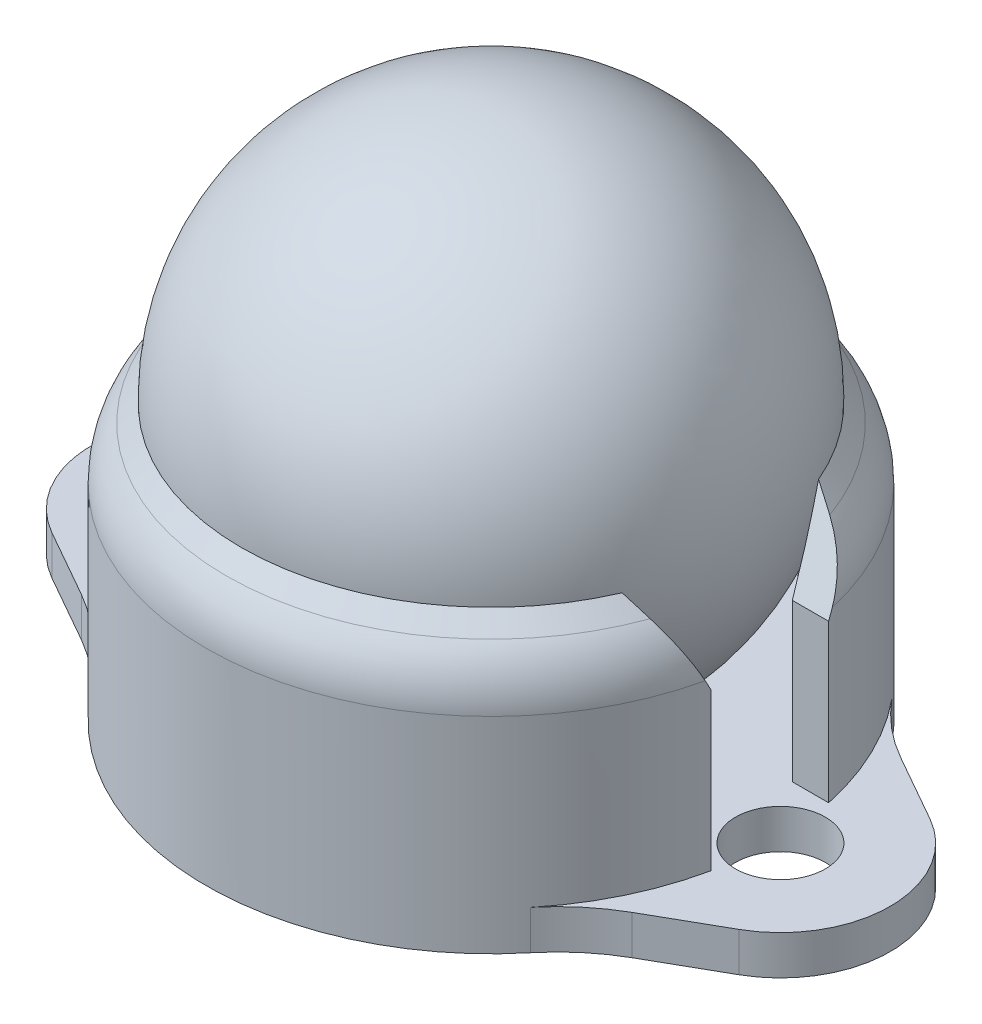
ISO-10303-21;
HEADER;
FILE_DESCRIPTION(('STEP AP214'),'2;1');
FILE_NAME('part.step','',(''),(''),'','','');
FILE_SCHEMA(('AUTOMOTIVE_DESIGN { 1 0 10303 214 1 1 1 1 }'));
ENDSEC;
DATA;
#1=APPLICATION_CONTEXT('core data for automotive mechanical design processes');
#2=APPLICATION_PROTOCOL_DEFINITION('international standard','automotive_design',2000,#1);
#3=PRODUCT_CONTEXT('',#1,'mechanical');
#4=PRODUCT('Part','Part','',(#3));
#5=PRODUCT_RELATED_PRODUCT_CATEGORY('part','',(#4));
#6=PRODUCT_DEFINITION_FORMATION('','',#4);
#7=PRODUCT_DEFINITION_CONTEXT('part definition',#1,'design');
#8=PRODUCT_DEFINITION('design','',#6,#7);
#9=PRODUCT_DEFINITION_SHAPE('','',#8);
#10=(LENGTH_UNIT() NAMED_UNIT(*) SI_UNIT(.MILLI.,.METRE.));
#11=(NAMED_UNIT(*) PLANE_ANGLE_UNIT() SI_UNIT($,.RADIAN.));
#12=(NAMED_UNIT(*) SI_UNIT($,.STERADIAN.) SOLID_ANGLE_UNIT());
#13=UNCERTAINTY_MEASURE_WITH_UNIT(LENGTH_MEASURE(1.E-05),#10,'distance_accuracy_value','');
#14=(GEOMETRIC_REPRESENTATION_CONTEXT(3) GLOBAL_UNCERTAINTY_ASSIGNED_CONTEXT((#13)) GLOBAL_UNIT_ASSIGNED_CONTEXT((#10,
#11,#12)) REPRESENTATION_CONTEXT('',''));
#15=CARTESIAN_POINT('',(0.,0.,0.));
#16=DIRECTION('',(0.,0.,1.));
#17=DIRECTION('',(1.,0.,0.));
#18=AXIS2_PLACEMENT_3D('',#15,#16,#17);
#19=CARTESIAN_POINT('',(0.,7.112,0.));
#20=DIRECTION('',(0.,-1.,0.));
#21=DIRECTION('',(1.,0.,0.));
#22=AXIS2_PLACEMENT_3D('',#19,#20,#21);
#23=SPHERICAL_SURFACE('',#22,6.35);
#24=CARTESIAN_POINT('',(0.,0.762000000000001,0.));
#25=VERTEX_POINT('',#24);
#26=VERTEX_LOOP('',#25);
#27=FACE_BOUND('',#26,.T.);
#28=ADVANCED_FACE('F41',(#27),#23,.T.);
#29=CLOSED_SHELL('',(#28));
#30=MANIFOLD_SOLID_BREP('B2',#29);
#31=CARTESIAN_POINT('',(0.,1.,0.));
#32=DIRECTION('',(0.,-1.,0.));
#33=DIRECTION('',(0.,0.,-1.));
#34=AXIS2_PLACEMENT_3D('',#31,#32,#33);
#35=CYLINDRICAL_SURFACE('',#34,7.25);
#36=CARTESIAN_POINT('',(0.,2.,0.));
#37=DIRECTION('',(0.,0.447213595499958,0.894427190999916));
#38=DIRECTION('',(0.,-0.894427190999916,0.447213595499958));
#39=AXIS2_PLACEMENT_3D('',#36,#37,#38);
#40=ELLIPSE('',#39,16.2114928368735,7.25);
#41=CARTESIAN_POINT('',(-7.06761644124185,5.23190212691408,-1.61595106345704));
#42=VERTEX_POINT('',#41);
#43=CARTESIAN_POINT('',(-7.09313047955555,5.,-1.5));
#44=VERTEX_POINT('',#43);
#45=EDGE_CURVE('E229',#42,#44,#40,.T.);
#46=ORIENTED_EDGE('',*,*,#45,.F.);
#47=CARTESIAN_POINT('',(0.,5.23190212691408,0.));
#48=DIRECTION('',(0.,-1.,0.));
#49=DIRECTION('',(0.,0.,-1.));
#50=AXIS2_PLACEMENT_3D('',#47,#48,#49);
#51=CIRCLE('',#50,7.25);
#52=CARTESIAN_POINT('',(7.06761644124185,5.23190212691408,-1.61595106345704));
#53=VERTEX_POINT('',#52);
#54=EDGE_CURVE('E353',#42,#53,#51,.T.);
#55=ORIENTED_EDGE('',*,*,#54,.T.);
#56=CARTESIAN_POINT('',(7.09313047955555,5.,-1.5));
#57=VERTEX_POINT('',#56);
#58=EDGE_CURVE('E242',#57,#53,#40,.T.);
#59=ORIENTED_EDGE('',*,*,#58,.F.);
#60=DIRECTION('',(0.,-1.,0.));
#61=VECTOR('',#60,1.);
#62=CARTESIAN_POINT('',(7.09313047955555,1.,-1.5));
#63=LINE('',#62,#61);
#64=CARTESIAN_POINT('',(7.09313047955555,1.,-1.5));
#65=VERTEX_POINT('',#64);
#66=EDGE_CURVE('E254',#65,#57,#63,.F.);
#67=ORIENTED_EDGE('',*,*,#66,.F.);
#68=CARTESIAN_POINT('',(0.,1.,0.));
#69=DIRECTION('',(0.,-1.,0.));
#70=DIRECTION('',(0.,0.,-1.));
#71=AXIS2_PLACEMENT_3D('',#68,#69,#70);
#72=CIRCLE('',#71,7.25);
#73=CARTESIAN_POINT('',(5.60718383416359,1.,-4.59586656136735));
#74=VERTEX_POINT('',#73);
#75=EDGE_CURVE('E356',#74,#65,#72,.T.);
#76=ORIENTED_EDGE('',*,*,#75,.F.);
#77=DIRECTION('',(0.,-1.,0.));
#78=VECTOR('',#77,1.);
#79=CARTESIAN_POINT('',(5.60718383416359,1.,-4.59586656136735));
#80=LINE('',#79,#78);
#81=CARTESIAN_POINT('',(5.60718383416359,0.,-4.59586656136735));
#82=VERTEX_POINT('',#81);
#83=EDGE_CURVE('E457',#74,#82,#80,.T.);
#84=ORIENTED_EDGE('',*,*,#83,.T.);
#85=CARTESIAN_POINT('',(0.,0.,0.));
#86=DIRECTION('',(0.,1.,0.));
#87=DIRECTION('',(0.,0.,1.));
#88=AXIS2_PLACEMENT_3D('',#85,#86,#87);
#89=CIRCLE('',#88,7.25);
#90=CARTESIAN_POINT('',(-5.60718383416359,0.,-4.59586656136735));
#91=VERTEX_POINT('',#90);
#92=EDGE_CURVE('E443',#82,#91,#89,.T.);
#93=ORIENTED_EDGE('',*,*,#92,.T.);
#94=DIRECTION('',(0.,-1.,0.));
#95=VECTOR('',#94,1.);
#96=CARTESIAN_POINT('',(-5.60718383416359,1.,-4.59586656136735));
#97=LINE('',#96,#95);
#98=CARTESIAN_POINT('',(-5.60718383416359,1.,-4.59586656136735));
#99=VERTEX_POINT('',#98);
#100=EDGE_CURVE('E366',#99,#91,#97,.T.);
#101=ORIENTED_EDGE('',*,*,#100,.F.);
#102=CARTESIAN_POINT('',(-7.09313047955555,1.,-1.5));
#103=VERTEX_POINT('',#102);
#104=EDGE_CURVE('E252',#103,#99,#72,.T.);
#105=ORIENTED_EDGE('',*,*,#104,.F.);
#106=DIRECTION('',(0.,-1.,0.));
#107=VECTOR('',#106,1.);
#108=CARTESIAN_POINT('',(-7.09313047955555,1.,-1.5));
#109=LINE('',#108,#107);
#110=EDGE_CURVE('E245',#44,#103,#109,.T.);
#111=ORIENTED_EDGE('',*,*,#110,.F.);
#112=EDGE_LOOP('',(#46,#55,#59,#67,#76,#84,#93,#101,#105,#111));
#113=FACE_BOUND('',#112,.T.);
#114=ADVANCED_FACE('F54',(#113),#35,.T.);
#115=CARTESIAN_POINT('',(0.,5.23190212691408,0.));
#116=DIRECTION('',(0.,-1.,0.));
#117=DIRECTION('',(0.,0.,-1.));
#118=AXIS2_PLACEMENT_3D('',#115,#116,#117);
#119=TOROIDAL_SURFACE('',#118,5.25,2.);
#120=CARTESIAN_POINT('',(0.,6.57064228665848,0.));
#121=DIRECTION('',(0.,-1.,0.));
#122=DIRECTION('',(0.,0.,-1.));
#123=AXIS2_PLACEMENT_3D('',#120,#121,#122);
#124=CIRCLE('',#123,6.73585826534281);
#125=CARTESIAN_POINT('',(-6.33633126048816,6.57064228665848,-2.28532114332924));
#126=VERTEX_POINT('',#125);
#127=CARTESIAN_POINT('',(6.33633126048816,6.57064228665848,-2.28532114332924));
#128=VERTEX_POINT('',#127);
#129=EDGE_CURVE('E349',#126,#128,#124,.T.);
#130=ORIENTED_EDGE('',*,*,#129,.T.);
#131=CARTESIAN_POINT('',(6.33610360567806,6.57084228665848,-2.28542114332924));
#132=CARTESIAN_POINT('',(6.38720905247654,6.52595006579763,-2.26297503289881));
#133=CARTESIAN_POINT('',(6.43619885751783,6.47916484933496,-2.23958242466748));
#134=CARTESIAN_POINT('',(6.5296141205372,6.38207336245779,-2.19103668122889));
#135=CARTESIAN_POINT('',(6.57403910189025,6.33176672528274,-2.16588336264137));
#136=CARTESIAN_POINT('',(6.6974554096252,6.17906551212596,-2.08953275606298));
#137=CARTESIAN_POINT('',(6.76965959015316,6.07218143816049,-2.03609071908025));
#138=CARTESIAN_POINT('',(6.89333253889709,5.84824603708838,-1.92412301854419));
#139=CARTESIAN_POINT('',(6.94465554716202,5.73112994564584,-1.86556497282292));
#140=CARTESIAN_POINT('',(7.00448934248536,5.54910103338356,-1.77455051669178));
#141=CARTESIAN_POINT('',(7.02169421977967,5.48639515666394,-1.74319757833197));
#142=CARTESIAN_POINT('',(7.04960290403054,5.35980992303815,-1.67990496151907));
#143=CARTESIAN_POINT('',(7.06030389415051,5.29593007000405,-1.64796503500202));
#144=CARTESIAN_POINT('',(7.06763929439843,5.23170212691408,-1.61585106345704));
#145=B_SPLINE_CURVE_WITH_KNOTS('',3,(#131,#132,#133,#134,#135,#136,#137,#138,#139,#140,#141,
#142,#143,#144),.UNSPECIFIED.,.F.,.F.,(4,2,2,2,2,2,4),(0.,0.214773507266159,0.42956941685027,
0.846385742050743,1.26606367421198,1.48235583176192,1.69874159891815),.UNSPECIFIED.);
#146=EDGE_CURVE('E293',#128,#53,#145,.T.);
#147=ORIENTED_EDGE('',*,*,#146,.T.);
#148=ORIENTED_EDGE('',*,*,#54,.F.);
#149=CARTESIAN_POINT('',(-7.06763929439843,5.23170212691408,-1.61585106345704));
#150=CARTESIAN_POINT('',(-7.06066962741802,5.29273547119952,-1.64636773559976));
#151=CARTESIAN_POINT('',(-7.05065900533507,5.35345846114629,-1.67672923057315));
#152=CARTESIAN_POINT('',(-7.02475089286815,5.47386509060165,-1.73693254530082));
#153=CARTESIAN_POINT('',(-7.00885598370298,5.53354917383855,-1.76677458691928));
#154=CARTESIAN_POINT('',(-6.95368899624164,5.70714399689122,-1.85357199844561));
#155=CARTESIAN_POINT('',(-6.90650793163667,5.81910628251045,-1.90955314125522));
#156=CARTESIAN_POINT('',(-6.78710624085704,6.04487167275266,-2.02243583637633));
#157=CARTESIAN_POINT('',(-6.71294667405066,6.15785600179062,-2.07892800089531));
#158=CARTESIAN_POINT('',(-6.58500078256002,6.31904700660519,-2.1595235033026));
#159=CARTESIAN_POINT('',(-6.53871811930285,6.37214575803145,-2.18607287901573));
#160=CARTESIAN_POINT('',(-6.44110239471256,6.47447106276408,-2.23723553138204));
#161=CARTESIAN_POINT('',(-6.38977042612975,6.52369844976389,-2.26184922488195));
#162=CARTESIAN_POINT('',(-6.33610360567806,6.57084228665848,-2.28542114332924));
#163=B_SPLINE_CURVE_WITH_KNOTS('',3,(#149,#150,#151,#152,#153,#154,#155,#156,#157,#158,#159,
#160,#161,#162),.UNSPECIFIED.,.F.,.F.,(4,2,2,2,2,2,4),(0.,0.20564259875086,0.411195096394616,
0.810619462241715,1.24764195242736,1.47321368363546,1.69873670447507),.UNSPECIFIED.);
#164=EDGE_CURVE('E235',#42,#126,#163,.T.);
#165=ORIENTED_EDGE('',*,*,#164,.T.);
#166=EDGE_LOOP('',(#130,#147,#148,#165));
#167=FACE_BOUND('',#166,.T.);
#168=ADVANCED_FACE('F310',(#167),#119,.T.);
#169=CARTESIAN_POINT('',(0.,6.57064228665848,0.));
#170=DIRECTION('',(0.,-1.,0.));
#171=DIRECTION('',(0.,0.,-1.));
#172=AXIS2_PLACEMENT_3D('',#169,#170,#171);
#173=CONICAL_SURFACE('',#172,6.73585826534281,0.733360576003534);
#174=CARTESIAN_POINT('',(0.,7.,0.));
#175=DIRECTION('',(0.,-1.,0.));
#176=DIRECTION('',(0.,0.,-1.));
#177=AXIS2_PLACEMENT_3D('',#174,#175,#176);
#178=CIRCLE('',#177,6.34901220663498);
#179=CARTESIAN_POINT('',(-5.83609081492055,7.,-2.5));
#180=VERTEX_POINT('',#179);
#181=CARTESIAN_POINT('',(5.83609081492055,7.,-2.5));
#182=VERTEX_POINT('',#181);
#183=EDGE_CURVE('E340',#180,#182,#178,.T.);
#184=ORIENTED_EDGE('',*,*,#183,.T.);
#185=CARTESIAN_POINT('',(5.83585194033158,7.0002,-2.5001));
#186=CARTESIAN_POINT('',(5.87807255301973,6.96485064787608,-2.48242532393804));
#187=CARTESIAN_POINT('',(5.92016358221079,6.92937761447314,-2.46468880723657));
#188=CARTESIAN_POINT('',(6.00409406345178,6.85819694235963,-2.42909847117981));
#189=CARTESIAN_POINT('',(6.0459335245734,6.82248931220709,-2.41124465610354));
#190=CARTESIAN_POINT('',(6.12937139967283,6.75084974203165,-2.37542487101583));
#191=CARTESIAN_POINT('',(6.17096981435526,6.71491780266509,-2.35745890133254));
#192=CARTESIAN_POINT('',(6.25393576360961,6.64283861144875,-2.32141930572438));
#193=CARTESIAN_POINT('',(6.29530328975066,6.60669135183494,-2.30334567591747));
#194=CARTESIAN_POINT('',(6.33655888473935,6.57044228665848,-2.28522114332924));
#195=B_SPLINE_CURVE_WITH_KNOTS('',3,(#185,#186,#187,#188,#189,#190,#191,#192,#193,#194),
.UNSPECIFIED.,.F.,.F.,(4,2,2,2,4),(0.,0.173495818993947,0.346985343655919,0.520474360920202,
0.693969672202868),.UNSPECIFIED.);
#196=EDGE_CURVE('E240',#182,#128,#195,.T.);
#197=ORIENTED_EDGE('',*,*,#196,.T.);
#198=ORIENTED_EDGE('',*,*,#129,.F.);
#199=CARTESIAN_POINT('',(-6.33655888473935,6.57044228665848,-2.28522114332924));
#200=CARTESIAN_POINT('',(-6.29530328975066,6.60669135183494,-2.30334567591747));
#201=CARTESIAN_POINT('',(-6.25393576360961,6.64283861144875,-2.32141930572438));
#202=CARTESIAN_POINT('',(-6.17096981435526,6.71491780266509,-2.35745890133254));
#203=CARTESIAN_POINT('',(-6.12937139967282,6.75084974203165,-2.37542487101583));
#204=CARTESIAN_POINT('',(-6.0459335245734,6.82248931220709,-2.41124465610354));
#205=CARTESIAN_POINT('',(-6.00409406345178,6.85819694235963,-2.42909847117981));
#206=CARTESIAN_POINT('',(-5.92016358221079,6.92937761447314,-2.46468880723657));
#207=CARTESIAN_POINT('',(-5.87807255301973,6.96485064787608,-2.48242532393804));
#208=CARTESIAN_POINT('',(-5.83585194033158,7.0002,-2.5001));
#209=B_SPLINE_CURVE_WITH_KNOTS('',3,(#199,#200,#201,#202,#203,#204,#205,#206,#207,#208),
.UNSPECIFIED.,.F.,.F.,(4,2,2,2,4),(0.,0.173495311282667,0.346984328546951,0.520473853208922,
0.69396967220287),.UNSPECIFIED.);
#210=EDGE_CURVE('E253',#126,#180,#209,.T.);
#211=ORIENTED_EDGE('',*,*,#210,.T.);
#212=EDGE_LOOP('',(#184,#197,#198,#211));
#213=FACE_BOUND('',#212,.T.);
#214=ADVANCED_FACE('F581',(#213),#173,.T.);
#215=CARTESIAN_POINT('',(0.,0.,0.));
#216=DIRECTION('',(0.,-1.,0.));
#217=DIRECTION('',(0.,0.,-1.));
#218=AXIS2_PLACEMENT_3D('',#215,#216,#217);
#219=CYLINDRICAL_SURFACE('',#218,6.34901220663498);
#220=ORIENTED_EDGE('',*,*,#183,.F.);
#221=CARTESIAN_POINT('',(0.,2.,0.));
#222=DIRECTION('',(0.,0.447213595499958,0.894427190999916));
#223=DIRECTION('',(0.,-0.894427190999916,0.447213595499958));
#224=AXIS2_PLACEMENT_3D('',#221,#222,#223);
#225=ELLIPSE('',#224,14.1968228840118,6.34901220663498);
#226=CARTESIAN_POINT('',(-6.16927516001677,5.,-1.5));
#227=VERTEX_POINT('',#226);
#228=EDGE_CURVE('E380',#180,#227,#225,.T.);
#229=ORIENTED_EDGE('',*,*,#228,.T.);
#230=DIRECTION('',(0.,-1.,0.));
#231=VECTOR('',#230,1.);
#232=CARTESIAN_POINT('',(-6.16927516001677,0.,-1.5));
#233=LINE('',#232,#231);
#234=CARTESIAN_POINT('',(-6.16927516001678,1.,-1.5));
#235=VERTEX_POINT('',#234);
#236=EDGE_CURVE('E248',#227,#235,#233,.T.);
#237=ORIENTED_EDGE('',*,*,#236,.T.);
#238=CARTESIAN_POINT('',(0.,1.,0.));
#239=DIRECTION('',(0.,-1.,0.));
#240=DIRECTION('',(0.,0.,-1.));
#241=AXIS2_PLACEMENT_3D('',#238,#239,#240);
#242=CIRCLE('',#241,6.34901220663498);
#243=CARTESIAN_POINT('',(6.16927516001678,1.,-1.5));
#244=VERTEX_POINT('',#243);
#245=EDGE_CURVE('E341',#235,#244,#242,.T.);
#246=ORIENTED_EDGE('',*,*,#245,.T.);
#247=DIRECTION('',(0.,-1.,0.));
#248=VECTOR('',#247,1.);
#249=CARTESIAN_POINT('',(6.16927516001677,0.,-1.5));
#250=LINE('',#249,#248);
#251=CARTESIAN_POINT('',(6.16927516001677,5.,-1.5));
#252=VERTEX_POINT('',#251);
#253=EDGE_CURVE('E385',#244,#252,#250,.F.);
#254=ORIENTED_EDGE('',*,*,#253,.T.);
#255=EDGE_CURVE('E382',#252,#182,#225,.T.);
#256=ORIENTED_EDGE('',*,*,#255,.T.);
#257=EDGE_LOOP('',(#220,#229,#237,#246,#254,#256));
#258=FACE_BOUND('',#257,.T.);
#259=ADVANCED_FACE('F584',(#258),#219,.F.);
#260=CARTESIAN_POINT('',(-7.366,1.,0.));
#261=DIRECTION('',(0.,1.,0.));
#262=DIRECTION('',(0.,0.,1.));
#263=AXIS2_PLACEMENT_3D('',#260,#261,#262);
#264=PLANE('',#263);
#265=CARTESIAN_POINT('',(6.16927516001678,1.,1.5));
#266=VERTEX_POINT('',#265);
#267=CARTESIAN_POINT('',(-6.16927516001677,1.,1.5));
#268=VERTEX_POINT('',#267);
#269=EDGE_CURVE('E344',#266,#268,#242,.T.);
#270=ORIENTED_EDGE('',*,*,#269,.F.);
#271=DIRECTION('',(1.,0.,0.));
#272=VECTOR('',#271,1.);
#273=CARTESIAN_POINT('',(-10.16,1.,1.5));
#274=LINE('',#273,#272);
#275=CARTESIAN_POINT('',(7.09313047955555,1.,1.5));
#276=VERTEX_POINT('',#275);
#277=EDGE_CURVE('E497',#266,#276,#274,.T.);
#278=ORIENTED_EDGE('',*,*,#277,.T.);
#279=CARTESIAN_POINT('',(5.60718383416359,1.,4.59586656136735));
#280=VERTEX_POINT('',#279);
#281=EDGE_CURVE('E58',#276,#280,#72,.T.);
#282=ORIENTED_EDGE('',*,*,#281,.T.);
#283=CARTESIAN_POINT('',(9.47420716806951,1.,7.76542970713794));
#284=DIRECTION('',(0.,-1.,0.));
#285=DIRECTION('',(0.,0.,1.));
#286=AXIS2_PLACEMENT_3D('',#283,#284,#285);
#287=CIRCLE('',#286,5.);
#288=CARTESIAN_POINT('',(7.00594574266768,1.,3.41713285252079));
#289=VERTEX_POINT('',#288);
#290=EDGE_CURVE('E397',#280,#289,#287,.T.);
#291=ORIENTED_EDGE('',*,*,#290,.T.);
#292=DIRECTION('',(0.869659370923429,0.,-0.493652285080366));
#293=VECTOR('',#292,1.);
#294=CARTESIAN_POINT('',(8.74526448451454,1.,2.42982828236006));
#295=LINE('',#294,#293);
#296=CARTESIAN_POINT('',(8.74526448451454,1.,2.42982828236006));
#297=VERTEX_POINT('',#296);
#298=EDGE_CURVE('E403',#289,#297,#295,.T.);
#299=ORIENTED_EDGE('',*,*,#298,.T.);
#300=CARTESIAN_POINT('',(7.366,1.,0.));
#301=DIRECTION('',(0.,1.,0.));
#302=DIRECTION('',(0.,0.,-1.));
#303=AXIS2_PLACEMENT_3D('',#300,#301,#302);
#304=CIRCLE('',#303,2.794);
#305=CARTESIAN_POINT('',(8.74526448451454,1.,-2.42982828236006));
#306=VERTEX_POINT('',#305);
#307=EDGE_CURVE('E414',#297,#306,#304,.T.);
#308=ORIENTED_EDGE('',*,*,#307,.T.);
#309=DIRECTION('',(-0.869659370923429,0.,-0.493652285080366));
#310=VECTOR('',#309,1.);
#311=CARTESIAN_POINT('',(8.74526448451454,1.,-2.42982828236006));
#312=LINE('',#311,#310);
#313=CARTESIAN_POINT('',(7.00594574266768,1.,-3.41713285252079));
#314=VERTEX_POINT('',#313);
#315=EDGE_CURVE('E416',#306,#314,#312,.T.);
#316=ORIENTED_EDGE('',*,*,#315,.T.);
#317=CARTESIAN_POINT('',(9.47420716806951,1.,-7.76542970713794));
#318=DIRECTION('',(0.,-1.,0.));
#319=DIRECTION('',(0.,0.,-1.));
#320=AXIS2_PLACEMENT_3D('',#317,#318,#319);
#321=CIRCLE('',#320,5.);
#322=EDGE_CURVE('E418',#314,#74,#321,.T.);
#323=ORIENTED_EDGE('',*,*,#322,.T.);
#324=ORIENTED_EDGE('',*,*,#75,.T.);
#325=DIRECTION('',(1.,0.,0.));
#326=VECTOR('',#325,1.);
#327=CARTESIAN_POINT('',(-10.16,1.,-1.5));
#328=LINE('',#327,#326);
#329=EDGE_CURVE('E545',#244,#65,#328,.T.);
#330=ORIENTED_EDGE('',*,*,#329,.F.);
#331=ORIENTED_EDGE('',*,*,#245,.F.);
#332=EDGE_CURVE('E543',#103,#235,#328,.T.);
#333=ORIENTED_EDGE('',*,*,#332,.F.);
#334=ORIENTED_EDGE('',*,*,#104,.T.);
#335=CARTESIAN_POINT('',(-9.47420716806951,1.,-7.76542970713794));
#336=DIRECTION('',(0.,-1.,0.));
#337=DIRECTION('',(0.,0.,1.));
#338=AXIS2_PLACEMENT_3D('',#335,#336,#337);
#339=CIRCLE('',#338,5.);
#340=CARTESIAN_POINT('',(-7.00594574266768,1.,-3.41713285252079));
#341=VERTEX_POINT('',#340);
#342=EDGE_CURVE('E422',#99,#341,#339,.T.);
#343=ORIENTED_EDGE('',*,*,#342,.T.);
#344=DIRECTION('',(-0.869659370923429,0.,0.493652285080366));
#345=VECTOR('',#344,1.);
#346=CARTESIAN_POINT('',(-8.74526448451454,1.,-2.42982828236006));
#347=LINE('',#346,#345);
#348=CARTESIAN_POINT('',(-8.74526448451454,1.,-2.42982828236006));
#349=VERTEX_POINT('',#348);
#350=EDGE_CURVE('E419',#341,#349,#347,.T.);
#351=ORIENTED_EDGE('',*,*,#350,.T.);
#352=CARTESIAN_POINT('',(-7.366,1.,0.));
#353=DIRECTION('',(0.,1.,0.));
#354=DIRECTION('',(0.,0.,1.));
#355=AXIS2_PLACEMENT_3D('',#352,#353,#354);
#356=CIRCLE('',#355,2.794);
#357=CARTESIAN_POINT('',(-8.74526448451454,1.,2.42982828236006));
#358=VERTEX_POINT('',#357);
#359=EDGE_CURVE('E405',#349,#358,#356,.T.);
#360=ORIENTED_EDGE('',*,*,#359,.T.);
#361=DIRECTION('',(0.869659370923429,0.,0.493652285080366));
#362=VECTOR('',#361,1.);
#363=CARTESIAN_POINT('',(-8.74526448451454,1.,2.42982828236006));
#364=LINE('',#363,#362);
#365=CARTESIAN_POINT('',(-7.00594574266768,1.,3.41713285252079));
#366=VERTEX_POINT('',#365);
#367=EDGE_CURVE('E398',#358,#366,#364,.T.);
#368=ORIENTED_EDGE('',*,*,#367,.T.);
#369=CARTESIAN_POINT('',(-9.47420716806951,1.,7.76542970713794));
#370=DIRECTION('',(0.,-1.,0.));
#371=DIRECTION('',(0.,0.,-1.));
#372=AXIS2_PLACEMENT_3D('',#369,#370,#371);
#373=CIRCLE('',#372,5.);
#374=CARTESIAN_POINT('',(-5.60718383416359,1.,4.59586656136735));
#375=VERTEX_POINT('',#374);
#376=EDGE_CURVE('E396',#366,#375,#373,.T.);
#377=ORIENTED_EDGE('',*,*,#376,.T.);
#378=CARTESIAN_POINT('',(-7.09313047955555,1.,1.5));
#379=VERTEX_POINT('',#378);
#380=EDGE_CURVE('E372',#375,#379,#72,.T.);
#381=ORIENTED_EDGE('',*,*,#380,.T.);
#382=EDGE_CURVE('E258',#379,#268,#274,.T.);
#383=ORIENTED_EDGE('',*,*,#382,.T.);
#384=EDGE_LOOP('',(#270,#278,#282,#291,#299,#308,#316,#323,#324,#330,#331,#333,#334,#343,#351,
#360,#368,#377,#381,#383));
#385=FACE_BOUND('',#384,.T.);
#386=CARTESIAN_POINT('',(7.366,1.,0.));
#387=DIRECTION('',(0.,1.,0.));
#388=DIRECTION('',(0.,0.,-1.));
#389=AXIS2_PLACEMENT_3D('',#386,#387,#388);
#390=CIRCLE('',#389,1.143);
#391=CARTESIAN_POINT('',(7.366,1.,-1.143));
#392=VERTEX_POINT('',#391);
#393=EDGE_CURVE('E360',#392,#392,#390,.T.);
#394=ORIENTED_EDGE('',*,*,#393,.F.);
#395=EDGE_LOOP('',(#394));
#396=FACE_BOUND('',#395,.T.);
#397=CARTESIAN_POINT('',(-7.366,1.,0.));
#398=DIRECTION('',(0.,1.,0.));
#399=DIRECTION('',(0.,0.,1.));
#400=AXIS2_PLACEMENT_3D('',#397,#398,#399);
#401=CIRCLE('',#400,1.143);
#402=CARTESIAN_POINT('',(-7.366,1.,1.143));
#403=VERTEX_POINT('',#402);
#404=EDGE_CURVE('E427',#403,#403,#401,.T.);
#405=ORIENTED_EDGE('',*,*,#404,.F.);
#406=EDGE_LOOP('',(#405));
#407=FACE_BOUND('',#406,.T.);
#408=ADVANCED_FACE('F493',(#385,#396,#407),#264,.T.);
#409=CARTESIAN_POINT('',(-7.366,0.,0.));
#410=DIRECTION('',(0.,1.,0.));
#411=DIRECTION('',(0.,0.,1.));
#412=AXIS2_PLACEMENT_3D('',#409,#410,#411);
#413=PLANE('',#412);
#414=CARTESIAN_POINT('',(-7.366,0.,0.));
#415=DIRECTION('',(0.,1.,0.));
#416=DIRECTION('',(0.,0.,1.));
#417=AXIS2_PLACEMENT_3D('',#414,#415,#416);
#418=CIRCLE('',#417,1.143);
#419=CARTESIAN_POINT('',(-7.366,0.,1.143));
#420=VERTEX_POINT('',#419);
#421=EDGE_CURVE('E645',#420,#420,#418,.T.);
#422=ORIENTED_EDGE('',*,*,#421,.T.);
#423=EDGE_LOOP('',(#422));
#424=FACE_BOUND('',#423,.T.);
#425=CARTESIAN_POINT('',(-7.366,0.,0.));
#426=DIRECTION('',(0.,1.,0.));
#427=DIRECTION('',(0.,0.,1.));
#428=AXIS2_PLACEMENT_3D('',#425,#426,#427);
#429=CIRCLE('',#428,2.794);
#430=CARTESIAN_POINT('',(-8.74526448451454,0.,-2.42982828236006));
#431=VERTEX_POINT('',#430);
#432=CARTESIAN_POINT('',(-8.74526448451454,0.,2.42982828236006));
#433=VERTEX_POINT('',#432);
#434=EDGE_CURVE('E423',#431,#433,#429,.T.);
#435=ORIENTED_EDGE('',*,*,#434,.F.);
#436=DIRECTION('',(-0.869659370923429,0.,0.493652285080366));
#437=VECTOR('',#436,1.);
#438=CARTESIAN_POINT('',(-8.74526448451454,0.,-2.42982828236006));
#439=LINE('',#438,#437);
#440=CARTESIAN_POINT('',(-7.00594574266768,0.,-3.41713285252079));
#441=VERTEX_POINT('',#440);
#442=EDGE_CURVE('E409',#441,#431,#439,.T.);
#443=ORIENTED_EDGE('',*,*,#442,.F.);
#444=CARTESIAN_POINT('',(-9.47420716806951,0.,-7.76542970713794));
#445=DIRECTION('',(0.,-1.,0.));
#446=DIRECTION('',(0.,0.,1.));
#447=AXIS2_PLACEMENT_3D('',#444,#445,#446);
#448=CIRCLE('',#447,5.);
#449=EDGE_CURVE('E445',#91,#441,#448,.T.);
#450=ORIENTED_EDGE('',*,*,#449,.F.);
#451=ORIENTED_EDGE('',*,*,#92,.F.);
#452=CARTESIAN_POINT('',(9.47420716806951,0.,-7.76542970713794));
#453=DIRECTION('',(0.,-1.,0.));
#454=DIRECTION('',(0.,0.,-1.));
#455=AXIS2_PLACEMENT_3D('',#452,#453,#454);
#456=CIRCLE('',#455,5.);
#457=CARTESIAN_POINT('',(7.00594574266768,0.,-3.41713285252079));
#458=VERTEX_POINT('',#457);
#459=EDGE_CURVE('E441',#458,#82,#456,.T.);
#460=ORIENTED_EDGE('',*,*,#459,.F.);
#461=DIRECTION('',(-0.869659370923429,0.,-0.493652285080366));
#462=VECTOR('',#461,1.);
#463=CARTESIAN_POINT('',(8.74526448451454,0.,-2.42982828236006));
#464=LINE('',#463,#462);
#465=CARTESIAN_POINT('',(8.74526448451454,0.,-2.42982828236006));
#466=VERTEX_POINT('',#465);
#467=EDGE_CURVE('E439',#466,#458,#464,.T.);
#468=ORIENTED_EDGE('',*,*,#467,.F.);
#469=CARTESIAN_POINT('',(7.366,0.,0.));
#470=DIRECTION('',(0.,1.,0.));
#471=DIRECTION('',(0.,0.,-1.));
#472=AXIS2_PLACEMENT_3D('',#469,#470,#471);
#473=CIRCLE('',#472,2.794);
#474=CARTESIAN_POINT('',(8.74526448451454,0.,2.42982828236006));
#475=VERTEX_POINT('',#474);
#476=EDGE_CURVE('E437',#475,#466,#473,.T.);
#477=ORIENTED_EDGE('',*,*,#476,.F.);
#478=DIRECTION('',(0.869659370923429,0.,-0.493652285080366));
#479=VECTOR('',#478,1.);
#480=CARTESIAN_POINT('',(8.74526448451454,0.,2.42982828236006));
#481=LINE('',#480,#479);
#482=CARTESIAN_POINT('',(7.00594574266768,0.,3.41713285252079));
#483=VERTEX_POINT('',#482);
#484=EDGE_CURVE('E435',#483,#475,#481,.T.);
#485=ORIENTED_EDGE('',*,*,#484,.F.);
#486=CARTESIAN_POINT('',(9.47420716806951,0.,7.76542970713794));
#487=DIRECTION('',(0.,-1.,0.));
#488=DIRECTION('',(0.,0.,1.));
#489=AXIS2_PLACEMENT_3D('',#486,#487,#488);
#490=CIRCLE('',#489,5.);
#491=CARTESIAN_POINT('',(5.60718383416359,0.,4.59586656136735));
#492=VERTEX_POINT('',#491);
#493=EDGE_CURVE('E433',#492,#483,#490,.T.);
#494=ORIENTED_EDGE('',*,*,#493,.F.);
#495=CARTESIAN_POINT('',(0.,0.,0.));
#496=DIRECTION('',(0.,1.,0.));
#497=DIRECTION('',(0.,0.,1.));
#498=AXIS2_PLACEMENT_3D('',#495,#496,#497);
#499=CIRCLE('',#498,7.25);
#500=CARTESIAN_POINT('',(-5.60718383416359,0.,4.59586656136735));
#501=VERTEX_POINT('',#500);
#502=EDGE_CURVE('E431',#501,#492,#499,.T.);
#503=ORIENTED_EDGE('',*,*,#502,.F.);
#504=CARTESIAN_POINT('',(-9.47420716806951,0.,7.76542970713794));
#505=DIRECTION('',(0.,-1.,0.));
#506=DIRECTION('',(0.,0.,-1.));
#507=AXIS2_PLACEMENT_3D('',#504,#505,#506);
#508=CIRCLE('',#507,5.);
#509=CARTESIAN_POINT('',(-7.00594574266768,0.,3.41713285252079));
#510=VERTEX_POINT('',#509);
#511=EDGE_CURVE('E429',#510,#501,#508,.T.);
#512=ORIENTED_EDGE('',*,*,#511,.F.);
#513=DIRECTION('',(0.869659370923429,0.,0.493652285080366));
#514=VECTOR('',#513,1.);
#515=CARTESIAN_POINT('',(-8.74526448451454,0.,2.42982828236006));
#516=LINE('',#515,#514);
#517=EDGE_CURVE('E426',#433,#510,#516,.T.);
#518=ORIENTED_EDGE('',*,*,#517,.F.);
#519=EDGE_LOOP('',(#435,#443,#450,#451,#460,#468,#477,#485,#494,#503,#512,#518));
#520=FACE_BOUND('',#519,.T.);
#521=CARTESIAN_POINT('',(7.366,0.,0.));
#522=DIRECTION('',(0.,1.,0.));
#523=DIRECTION('',(0.,0.,-1.));
#524=AXIS2_PLACEMENT_3D('',#521,#522,#523);
#525=CIRCLE('',#524,1.143);
#526=CARTESIAN_POINT('',(7.366,0.,-1.143));
#527=VERTEX_POINT('',#526);
#528=EDGE_CURVE('E359',#527,#527,#525,.T.);
#529=ORIENTED_EDGE('',*,*,#528,.T.);
#530=EDGE_LOOP('',(#529));
#531=FACE_BOUND('',#530,.T.);
#532=ADVANCED_FACE('F478',(#424,#520,#531),#413,.F.);
#533=CARTESIAN_POINT('',(-7.366,1.,0.));
#534=DIRECTION('',(0.,-1.,0.));
#535=DIRECTION('',(0.,0.,-1.));
#536=AXIS2_PLACEMENT_3D('',#533,#534,#535);
#537=CYLINDRICAL_SURFACE('',#536,2.794);
#538=ORIENTED_EDGE('',*,*,#434,.T.);
#539=DIRECTION('',(0.,-1.,0.));
#540=VECTOR('',#539,1.);
#541=CARTESIAN_POINT('',(-8.74526448451454,1.,2.42982828236006));
#542=LINE('',#541,#540);
#543=EDGE_CURVE('E345',#358,#433,#542,.T.);
#544=ORIENTED_EDGE('',*,*,#543,.F.);
#545=ORIENTED_EDGE('',*,*,#359,.F.);
#546=DIRECTION('',(0.,-1.,0.));
#547=VECTOR('',#546,1.);
#548=CARTESIAN_POINT('',(-8.74526448451454,1.,-2.42982828236006));
#549=LINE('',#548,#547);
#550=EDGE_CURVE('E421',#349,#431,#549,.T.);
#551=ORIENTED_EDGE('',*,*,#550,.T.);
#552=EDGE_LOOP('',(#538,#544,#545,#551));
#553=FACE_BOUND('',#552,.T.);
#554=ADVANCED_FACE('F56',(#553),#537,.T.);
#555=CARTESIAN_POINT('',(-8.74526448451454,1.,2.42982828236006));
#556=DIRECTION('',(0.493652285080366,0.,-0.869659370923429));
#557=DIRECTION('',(-0.869659370923429,0.,-0.493652285080366));
#558=AXIS2_PLACEMENT_3D('',#555,#556,#557);
#559=PLANE('',#558);
#560=ORIENTED_EDGE('',*,*,#517,.T.);
#561=DIRECTION('',(0.,-1.,0.));
#562=VECTOR('',#561,1.);
#563=CARTESIAN_POINT('',(-7.00594574266768,1.,3.41713285252079));
#564=LINE('',#563,#562);
#565=EDGE_CURVE('E393',#366,#510,#564,.T.);
#566=ORIENTED_EDGE('',*,*,#565,.F.);
#567=ORIENTED_EDGE('',*,*,#367,.F.);
#568=ORIENTED_EDGE('',*,*,#543,.T.);
#569=EDGE_LOOP('',(#560,#566,#567,#568));
#570=FACE_BOUND('',#569,.T.);
#571=ADVANCED_FACE('F471',(#570),#559,.F.);
#572=CARTESIAN_POINT('',(-9.47420716806951,1.,7.76542970713794));
#573=DIRECTION('',(0.,-1.,0.));
#574=DIRECTION('',(0.,0.,-1.));
#575=AXIS2_PLACEMENT_3D('',#572,#573,#574);
#576=CYLINDRICAL_SURFACE('',#575,5.);
#577=ORIENTED_EDGE('',*,*,#511,.T.);
#578=DIRECTION('',(0.,-1.,0.));
#579=VECTOR('',#578,1.);
#580=CARTESIAN_POINT('',(-5.60718383416359,1.,4.59586656136735));
#581=LINE('',#580,#579);
#582=EDGE_CURVE('E390',#375,#501,#581,.T.);
#583=ORIENTED_EDGE('',*,*,#582,.F.);
#584=ORIENTED_EDGE('',*,*,#376,.F.);
#585=ORIENTED_EDGE('',*,*,#565,.T.);
#586=EDGE_LOOP('',(#577,#583,#584,#585));
#587=FACE_BOUND('',#586,.T.);
#588=ADVANCED_FACE('F483',(#587),#576,.F.);
#589=CARTESIAN_POINT('',(9.47420716806951,1.,7.76542970713794));
#590=DIRECTION('',(0.,-1.,0.));
#591=DIRECTION('',(0.,0.,-1.));
#592=AXIS2_PLACEMENT_3D('',#589,#590,#591);
#593=CYLINDRICAL_SURFACE('',#592,5.);
#594=ORIENTED_EDGE('',*,*,#493,.T.);
#595=DIRECTION('',(0.,-1.,0.));
#596=VECTOR('',#595,1.);
#597=CARTESIAN_POINT('',(7.00594574266768,1.,3.41713285252079));
#598=LINE('',#597,#596);
#599=EDGE_CURVE('E463',#289,#483,#598,.T.);
#600=ORIENTED_EDGE('',*,*,#599,.F.);
#601=ORIENTED_EDGE('',*,*,#290,.F.);
#602=DIRECTION('',(0.,-1.,0.));
#603=VECTOR('',#602,1.);
#604=CARTESIAN_POINT('',(5.60718383416359,1.,4.59586656136735));
#605=LINE('',#604,#603);
#606=EDGE_CURVE('E394',#280,#492,#605,.T.);
#607=ORIENTED_EDGE('',*,*,#606,.T.);
#608=EDGE_LOOP('',(#594,#600,#601,#607));
#609=FACE_BOUND('',#608,.T.);
#610=ADVANCED_FACE('F500',(#609),#593,.F.);
#611=CARTESIAN_POINT('',(8.74526448451454,1.,2.42982828236006));
#612=DIRECTION('',(-0.493652285080366,0.,-0.869659370923429));
#613=DIRECTION('',(-0.869659370923429,0.,0.493652285080366));
#614=AXIS2_PLACEMENT_3D('',#611,#612,#613);
#615=PLANE('',#614);
#616=ORIENTED_EDGE('',*,*,#484,.T.);
#617=DIRECTION('',(0.,-1.,0.));
#618=VECTOR('',#617,1.);
#619=CARTESIAN_POINT('',(8.74526448451454,1.,2.42982828236006));
#620=LINE('',#619,#618);
#621=EDGE_CURVE('E460',#297,#475,#620,.T.);
#622=ORIENTED_EDGE('',*,*,#621,.F.);
#623=ORIENTED_EDGE('',*,*,#298,.F.);
#624=ORIENTED_EDGE('',*,*,#599,.T.);
#625=EDGE_LOOP('',(#616,#622,#623,#624));
#626=FACE_BOUND('',#625,.T.);
#627=ADVANCED_FACE('F505',(#626),#615,.F.);
#628=CARTESIAN_POINT('',(7.366,1.,0.));
#629=DIRECTION('',(0.,-1.,0.));
#630=DIRECTION('',(0.,0.,-1.));
#631=AXIS2_PLACEMENT_3D('',#628,#629,#630);
#632=CYLINDRICAL_SURFACE('',#631,2.794);
#633=ORIENTED_EDGE('',*,*,#476,.T.);
#634=DIRECTION('',(0.,-1.,0.));
#635=VECTOR('',#634,1.);
#636=CARTESIAN_POINT('',(8.74526448451454,1.,-2.42982828236006));
#637=LINE('',#636,#635);
#638=EDGE_CURVE('E456',#306,#466,#637,.T.);
#639=ORIENTED_EDGE('',*,*,#638,.F.);
#640=ORIENTED_EDGE('',*,*,#307,.F.);
#641=ORIENTED_EDGE('',*,*,#621,.T.);
#642=EDGE_LOOP('',(#633,#639,#640,#641));
#643=FACE_BOUND('',#642,.T.);
#644=ADVANCED_FACE('F511',(#643),#632,.T.);
#645=CARTESIAN_POINT('',(8.74526448451454,1.,-2.42982828236006));
#646=DIRECTION('',(-0.493652285080366,0.,0.869659370923429));
#647=DIRECTION('',(0.869659370923429,0.,0.493652285080366));
#648=AXIS2_PLACEMENT_3D('',#645,#646,#647);
#649=PLANE('',#648);
#650=ORIENTED_EDGE('',*,*,#467,.T.);
#651=DIRECTION('',(0.,-1.,0.));
#652=VECTOR('',#651,1.);
#653=CARTESIAN_POINT('',(7.00594574266768,1.,-3.41713285252079));
#654=LINE('',#653,#652);
#655=EDGE_CURVE('E453',#314,#458,#654,.T.);
#656=ORIENTED_EDGE('',*,*,#655,.F.);
#657=ORIENTED_EDGE('',*,*,#315,.F.);
#658=ORIENTED_EDGE('',*,*,#638,.T.);
#659=EDGE_LOOP('',(#650,#656,#657,#658));
#660=FACE_BOUND('',#659,.T.);
#661=ADVANCED_FACE('F515',(#660),#649,.F.);
#662=CARTESIAN_POINT('',(9.47420716806951,1.,-7.76542970713794));
#663=DIRECTION('',(0.,-1.,0.));
#664=DIRECTION('',(0.,0.,-1.));
#665=AXIS2_PLACEMENT_3D('',#662,#663,#664);
#666=CYLINDRICAL_SURFACE('',#665,5.);
#667=ORIENTED_EDGE('',*,*,#459,.T.);
#668=ORIENTED_EDGE('',*,*,#83,.F.);
#669=ORIENTED_EDGE('',*,*,#322,.F.);
#670=ORIENTED_EDGE('',*,*,#655,.T.);
#671=EDGE_LOOP('',(#667,#668,#669,#670));
#672=FACE_BOUND('',#671,.T.);
#673=ADVANCED_FACE('F520',(#672),#666,.F.);
#674=ORIENTED_EDGE('',*,*,#281,.F.);
#675=DIRECTION('',(0.,-1.,0.));
#676=VECTOR('',#675,1.);
#677=CARTESIAN_POINT('',(7.09313047955555,1.,1.5));
#678=LINE('',#677,#676);
#679=CARTESIAN_POINT('',(7.09313047955555,5.,1.5));
#680=VERTEX_POINT('',#679);
#681=EDGE_CURVE('E334',#276,#680,#678,.F.);
#682=ORIENTED_EDGE('',*,*,#681,.T.);
#683=CARTESIAN_POINT('',(0.,2.,0.));
#684=DIRECTION('',(0.,-0.447213595499958,0.894427190999916));
#685=DIRECTION('',(0.,-0.894427190999916,-0.447213595499958));
#686=AXIS2_PLACEMENT_3D('',#683,#684,#685);
#687=ELLIPSE('',#686,16.2114928368735,7.25);
#688=CARTESIAN_POINT('',(7.06761644124185,5.23190212691408,1.61595106345704));
#689=VERTEX_POINT('',#688);
#690=EDGE_CURVE('E325',#680,#689,#687,.T.);
#691=ORIENTED_EDGE('',*,*,#690,.T.);
#692=CARTESIAN_POINT('',(-7.06761644124185,5.23190212691408,1.61595106345704));
#693=VERTEX_POINT('',#692);
#694=EDGE_CURVE('E355',#689,#693,#51,.T.);
#695=ORIENTED_EDGE('',*,*,#694,.T.);
#696=CARTESIAN_POINT('',(-7.09313047955555,5.,1.5));
#697=VERTEX_POINT('',#696);
#698=EDGE_CURVE('E321',#693,#697,#687,.T.);
#699=ORIENTED_EDGE('',*,*,#698,.T.);
#700=DIRECTION('',(0.,-1.,0.));
#701=VECTOR('',#700,1.);
#702=CARTESIAN_POINT('',(-7.09313047955555,1.,1.5));
#703=LINE('',#702,#701);
#704=EDGE_CURVE('E337',#697,#379,#703,.T.);
#705=ORIENTED_EDGE('',*,*,#704,.T.);
#706=ORIENTED_EDGE('',*,*,#380,.F.);
#707=ORIENTED_EDGE('',*,*,#582,.T.);
#708=ORIENTED_EDGE('',*,*,#502,.T.);
#709=ORIENTED_EDGE('',*,*,#606,.F.);
#710=EDGE_LOOP('',(#674,#682,#691,#695,#699,#705,#706,#707,#708,#709));
#711=FACE_BOUND('',#710,.T.);
#712=ADVANCED_FACE('F487',(#711),#35,.T.);
#713=CARTESIAN_POINT('',(-9.47420716806951,1.,-7.76542970713794));
#714=DIRECTION('',(0.,-1.,0.));
#715=DIRECTION('',(0.,0.,-1.));
#716=AXIS2_PLACEMENT_3D('',#713,#714,#715);
#717=CYLINDRICAL_SURFACE('',#716,5.);
#718=ORIENTED_EDGE('',*,*,#449,.T.);
#719=DIRECTION('',(0.,-1.,0.));
#720=VECTOR('',#719,1.);
#721=CARTESIAN_POINT('',(-7.00594574266768,1.,-3.41713285252079));
#722=LINE('',#721,#720);
#723=EDGE_CURVE('E450',#341,#441,#722,.T.);
#724=ORIENTED_EDGE('',*,*,#723,.F.);
#725=ORIENTED_EDGE('',*,*,#342,.F.);
#726=ORIENTED_EDGE('',*,*,#100,.T.);
#727=EDGE_LOOP('',(#718,#724,#725,#726));
#728=FACE_BOUND('',#727,.T.);
#729=ADVANCED_FACE('F539',(#728),#717,.F.);
#730=CARTESIAN_POINT('',(-8.74526448451454,1.,-2.42982828236006));
#731=DIRECTION('',(0.493652285080366,0.,0.869659370923429));
#732=DIRECTION('',(0.869659370923429,0.,-0.493652285080366));
#733=AXIS2_PLACEMENT_3D('',#730,#731,#732);
#734=PLANE('',#733);
#735=ORIENTED_EDGE('',*,*,#442,.T.);
#736=ORIENTED_EDGE('',*,*,#550,.F.);
#737=ORIENTED_EDGE('',*,*,#350,.F.);
#738=ORIENTED_EDGE('',*,*,#723,.T.);
#739=EDGE_LOOP('',(#735,#736,#737,#738));
#740=FACE_BOUND('',#739,.T.);
#741=ADVANCED_FACE('F602',(#740),#734,.F.);
#742=CARTESIAN_POINT('',(-7.366,1.,0.));
#743=DIRECTION('',(0.,-1.,0.));
#744=DIRECTION('',(0.,0.,-1.));
#745=AXIS2_PLACEMENT_3D('',#742,#743,#744);
#746=CYLINDRICAL_SURFACE('',#745,1.143);
#747=ORIENTED_EDGE('',*,*,#404,.T.);
#748=EDGE_LOOP('',(#747));
#749=FACE_BOUND('',#748,.T.);
#750=ORIENTED_EDGE('',*,*,#421,.F.);
#751=EDGE_LOOP('',(#750));
#752=FACE_BOUND('',#751,.T.);
#753=ADVANCED_FACE('F631',(#749,#752),#746,.F.);
#754=CARTESIAN_POINT('',(7.366,1.,0.));
#755=DIRECTION('',(0.,-1.,0.));
#756=DIRECTION('',(0.,0.,-1.));
#757=AXIS2_PLACEMENT_3D('',#754,#755,#756);
#758=CYLINDRICAL_SURFACE('',#757,1.143);
#759=ORIENTED_EDGE('',*,*,#393,.T.);
#760=EDGE_LOOP('',(#759));
#761=FACE_BOUND('',#760,.T.);
#762=ORIENTED_EDGE('',*,*,#528,.F.);
#763=EDGE_LOOP('',(#762));
#764=FACE_BOUND('',#763,.T.);
#765=ADVANCED_FACE('F308',(#761,#764),#758,.F.);
#766=CARTESIAN_POINT('',(6.33610360567806,6.57084228665848,2.28542114332924));
#767=CARTESIAN_POINT('',(6.38720905247654,6.52595006579763,2.26297503289881));
#768=CARTESIAN_POINT('',(6.43619885751783,6.47916484933496,2.23958242466748));
#769=CARTESIAN_POINT('',(6.5296141205372,6.38207336245779,2.19103668122889));
#770=CARTESIAN_POINT('',(6.57403910189025,6.33176672528274,2.16588336264137));
#771=CARTESIAN_POINT('',(6.6974554096252,6.17906551212596,2.08953275606298));
#772=CARTESIAN_POINT('',(6.76965959015316,6.07218143816049,2.03609071908025));
#773=CARTESIAN_POINT('',(6.89333253889709,5.84824603708838,1.92412301854419));
#774=CARTESIAN_POINT('',(6.94465554716202,5.73112994564584,1.86556497282292));
#775=CARTESIAN_POINT('',(7.00448934248536,5.54910103338356,1.77455051669178));
#776=CARTESIAN_POINT('',(7.02169421977967,5.48639515666394,1.74319757833197));
#777=CARTESIAN_POINT('',(7.04960290403054,5.35980992303815,1.67990496151907));
#778=CARTESIAN_POINT('',(7.06030389415051,5.29593007000405,1.64796503500202));
#779=CARTESIAN_POINT('',(7.06763929439843,5.23170212691408,1.61585106345704));
#780=B_SPLINE_CURVE_WITH_KNOTS('',3,(#766,#767,#768,#769,#770,#771,#772,#773,#774,#775,#776,
#777,#778,#779),.UNSPECIFIED.,.F.,.F.,(4,2,2,2,2,2,4),(0.,0.214773507266159,0.42956941685027,
0.846385742050743,1.26606367421198,1.48235583176192,1.69874159891815),.UNSPECIFIED.);
#781=CARTESIAN_POINT('',(6.33633126048816,6.57064228665848,2.28532114332924));
#782=VERTEX_POINT('',#781);
#783=EDGE_CURVE('E329',#782,#689,#780,.T.);
#784=ORIENTED_EDGE('',*,*,#783,.F.);
#785=CARTESIAN_POINT('',(-6.33633126048816,6.57064228665848,2.28532114332924));
#786=VERTEX_POINT('',#785);
#787=EDGE_CURVE('E352',#782,#786,#124,.T.);
#788=ORIENTED_EDGE('',*,*,#787,.T.);
#789=CARTESIAN_POINT('',(-7.06763929439843,5.23170212691408,1.61585106345704));
#790=CARTESIAN_POINT('',(-7.06066962741802,5.29273547119952,1.64636773559976));
#791=CARTESIAN_POINT('',(-7.05065900533507,5.35345846114629,1.67672923057315));
#792=CARTESIAN_POINT('',(-7.02475089286815,5.47386509060165,1.73693254530082));
#793=CARTESIAN_POINT('',(-7.00885598370298,5.53354917383855,1.76677458691928));
#794=CARTESIAN_POINT('',(-6.95368899624164,5.70714399689122,1.85357199844561));
#795=CARTESIAN_POINT('',(-6.90650793163667,5.81910628251045,1.90955314125522));
#796=CARTESIAN_POINT('',(-6.78710624085704,6.04487167275266,2.02243583637633));
#797=CARTESIAN_POINT('',(-6.71294667405066,6.15785600179062,2.07892800089531));
#798=CARTESIAN_POINT('',(-6.58500078256002,6.31904700660519,2.1595235033026));
#799=CARTESIAN_POINT('',(-6.53871811930285,6.37214575803145,2.18607287901573));
#800=CARTESIAN_POINT('',(-6.44110239471256,6.47447106276408,2.23723553138204));
#801=CARTESIAN_POINT('',(-6.38977042612975,6.52369844976389,2.26184922488195));
#802=CARTESIAN_POINT('',(-6.33610360567806,6.57084228665848,2.28542114332924));
#803=B_SPLINE_CURVE_WITH_KNOTS('',3,(#789,#790,#791,#792,#793,#794,#795,#796,#797,#798,#799,
#800,#801,#802),.UNSPECIFIED.,.F.,.F.,(4,2,2,2,2,2,4),(0.,0.20564259875086,0.411195096394616,
0.810619462241715,1.24764195242736,1.47321368363546,1.69873670447507),.UNSPECIFIED.);
#804=EDGE_CURVE('E316',#693,#786,#803,.T.);
#805=ORIENTED_EDGE('',*,*,#804,.F.);
#806=ORIENTED_EDGE('',*,*,#694,.F.);
#807=EDGE_LOOP('',(#784,#788,#805,#806));
#808=FACE_BOUND('',#807,.T.);
#809=ADVANCED_FACE('F304',(#808),#119,.T.);
#810=CARTESIAN_POINT('',(5.83585194033158,7.0002,2.5001));
#811=CARTESIAN_POINT('',(5.87807255301973,6.96485064787608,2.48242532393804));
#812=CARTESIAN_POINT('',(5.92016358221079,6.92937761447314,2.46468880723657));
#813=CARTESIAN_POINT('',(6.00409406345178,6.85819694235963,2.42909847117981));
#814=CARTESIAN_POINT('',(6.0459335245734,6.82248931220709,2.41124465610354));
#815=CARTESIAN_POINT('',(6.12937139967283,6.75084974203165,2.37542487101583));
#816=CARTESIAN_POINT('',(6.17096981435526,6.71491780266509,2.35745890133254));
#817=CARTESIAN_POINT('',(6.25393576360961,6.64283861144875,2.32141930572438));
#818=CARTESIAN_POINT('',(6.29530328975066,6.60669135183494,2.30334567591747));
#819=CARTESIAN_POINT('',(6.33655888473935,6.57044228665848,2.28522114332924));
#820=B_SPLINE_CURVE_WITH_KNOTS('',3,(#810,#811,#812,#813,#814,#815,#816,#817,#818,#819),
.UNSPECIFIED.,.F.,.F.,(4,2,2,2,4),(0.,0.173495818993947,0.346985343655919,0.520474360920202,
0.693969672202868),.UNSPECIFIED.);
#821=CARTESIAN_POINT('',(5.83609081492055,7.,2.5));
#822=VERTEX_POINT('',#821);
#823=EDGE_CURVE('E324',#822,#782,#820,.T.);
#824=ORIENTED_EDGE('',*,*,#823,.F.);
#825=CARTESIAN_POINT('',(-5.83609081492055,7.,2.5));
#826=VERTEX_POINT('',#825);
#827=EDGE_CURVE('E348',#822,#826,#178,.T.);
#828=ORIENTED_EDGE('',*,*,#827,.T.);
#829=CARTESIAN_POINT('',(-6.33655888473935,6.57044228665848,2.28522114332924));
#830=CARTESIAN_POINT('',(-6.29530328975066,6.60669135183494,2.30334567591747));
#831=CARTESIAN_POINT('',(-6.25393576360961,6.64283861144875,2.32141930572438));
#832=CARTESIAN_POINT('',(-6.17096981435526,6.71491780266509,2.35745890133254));
#833=CARTESIAN_POINT('',(-6.12937139967282,6.75084974203165,2.37542487101583));
#834=CARTESIAN_POINT('',(-6.0459335245734,6.82248931220709,2.41124465610354));
#835=CARTESIAN_POINT('',(-6.00409406345178,6.85819694235963,2.42909847117981));
#836=CARTESIAN_POINT('',(-5.92016358221079,6.92937761447314,2.46468880723657));
#837=CARTESIAN_POINT('',(-5.87807255301973,6.96485064787608,2.48242532393804));
#838=CARTESIAN_POINT('',(-5.83585194033158,7.0002,2.5001));
#839=B_SPLINE_CURVE_WITH_KNOTS('',3,(#829,#830,#831,#832,#833,#834,#835,#836,#837,#838),
.UNSPECIFIED.,.F.,.F.,(4,2,2,2,4),(0.,0.173495311282667,0.346984328546951,0.520473853208922,
0.69396967220287),.UNSPECIFIED.);
#840=EDGE_CURVE('E299',#786,#826,#839,.T.);
#841=ORIENTED_EDGE('',*,*,#840,.F.);
#842=ORIENTED_EDGE('',*,*,#787,.F.);
#843=EDGE_LOOP('',(#824,#828,#841,#842));
#844=FACE_BOUND('',#843,.T.);
#845=ADVANCED_FACE('F271',(#844),#173,.T.);
#846=DIRECTION('',(0.,-1.,0.));
#847=VECTOR('',#846,1.);
#848=CARTESIAN_POINT('',(6.16927516001677,0.,1.5));
#849=LINE('',#848,#847);
#850=CARTESIAN_POINT('',(6.16927516001677,5.,1.5));
#851=VERTEX_POINT('',#850);
#852=EDGE_CURVE('E39',#266,#851,#849,.F.);
#853=ORIENTED_EDGE('',*,*,#852,.F.);
#854=ORIENTED_EDGE('',*,*,#269,.T.);
#855=DIRECTION('',(0.,-1.,0.));
#856=VECTOR('',#855,1.);
#857=CARTESIAN_POINT('',(-6.16927516001677,0.,1.5));
#858=LINE('',#857,#856);
#859=CARTESIAN_POINT('',(-6.16927516001677,5.,1.5));
#860=VERTEX_POINT('',#859);
#861=EDGE_CURVE('E376',#860,#268,#858,.T.);
#862=ORIENTED_EDGE('',*,*,#861,.F.);
#863=CARTESIAN_POINT('',(0.,2.,0.));
#864=DIRECTION('',(0.,-0.447213595499958,0.894427190999916));
#865=DIRECTION('',(0.,-0.894427190999916,-0.447213595499958));
#866=AXIS2_PLACEMENT_3D('',#863,#864,#865);
#867=ELLIPSE('',#866,14.1968228840118,6.34901220663498);
#868=EDGE_CURVE('E378',#826,#860,#867,.T.);
#869=ORIENTED_EDGE('',*,*,#868,.F.);
#870=ORIENTED_EDGE('',*,*,#827,.F.);
#871=EDGE_CURVE('E64',#851,#822,#867,.T.);
#872=ORIENTED_EDGE('',*,*,#871,.F.);
#873=EDGE_LOOP('',(#853,#854,#862,#869,#870,#872));
#874=FACE_BOUND('',#873,.T.);
#875=ADVANCED_FACE('F559',(#874),#219,.F.);
#876=CARTESIAN_POINT('',(-10.16,5.,-1.5));
#877=DIRECTION('',(0.,0.,1.));
#878=DIRECTION('',(0.,-1.,0.));
#879=AXIS2_PLACEMENT_3D('',#876,#877,#878);
#880=PLANE('',#879);
#881=ORIENTED_EDGE('',*,*,#66,.T.);
#882=DIRECTION('',(1.,0.,0.));
#883=VECTOR('',#882,1.);
#884=CARTESIAN_POINT('',(-10.16,5.,-1.5));
#885=LINE('',#884,#883);
#886=EDGE_CURVE('E79',#252,#57,#885,.T.);
#887=ORIENTED_EDGE('',*,*,#886,.F.);
#888=ORIENTED_EDGE('',*,*,#253,.F.);
#889=ORIENTED_EDGE('',*,*,#329,.T.);
#890=EDGE_LOOP('',(#881,#887,#888,#889));
#891=FACE_BOUND('',#890,.T.);
#892=ADVANCED_FACE('F279',(#891),#880,.T.);
#893=CARTESIAN_POINT('',(-10.16,7.,-2.5));
#894=DIRECTION('',(0.,0.447213595499958,0.894427190999916));
#895=DIRECTION('',(0.,-0.894427190999916,0.447213595499958));
#896=AXIS2_PLACEMENT_3D('',#893,#894,#895);
#897=PLANE('',#896);
#898=ORIENTED_EDGE('',*,*,#58,.T.);
#899=ORIENTED_EDGE('',*,*,#146,.F.);
#900=ORIENTED_EDGE('',*,*,#196,.F.);
#901=ORIENTED_EDGE('',*,*,#255,.F.);
#902=ORIENTED_EDGE('',*,*,#886,.T.);
#903=EDGE_LOOP('',(#898,#899,#900,#901,#902));
#904=FACE_BOUND('',#903,.T.);
#905=ADVANCED_FACE('F274',(#904),#897,.T.);
#906=ORIENTED_EDGE('',*,*,#110,.T.);
#907=ORIENTED_EDGE('',*,*,#332,.T.);
#908=ORIENTED_EDGE('',*,*,#236,.F.);
#909=EDGE_CURVE('E232',#44,#227,#885,.T.);
#910=ORIENTED_EDGE('',*,*,#909,.F.);
#911=EDGE_LOOP('',(#906,#907,#908,#910));
#912=FACE_BOUND('',#911,.T.);
#913=ADVANCED_FACE('F244',(#912),#880,.T.);
#914=ORIENTED_EDGE('',*,*,#45,.T.);
#915=ORIENTED_EDGE('',*,*,#909,.T.);
#916=ORIENTED_EDGE('',*,*,#228,.F.);
#917=ORIENTED_EDGE('',*,*,#210,.F.);
#918=ORIENTED_EDGE('',*,*,#164,.F.);
#919=EDGE_LOOP('',(#914,#915,#916,#917,#918));
#920=FACE_BOUND('',#919,.T.);
#921=ADVANCED_FACE('F231',(#920),#897,.T.);
#922=CARTESIAN_POINT('',(-10.16,7.,2.5));
#923=DIRECTION('',(0.,-0.447213595499958,0.894427190999916));
#924=DIRECTION('',(0.,-0.894427190999916,-0.447213595499958));
#925=AXIS2_PLACEMENT_3D('',#922,#923,#924);
#926=PLANE('',#925);
#927=ORIENTED_EDGE('',*,*,#804,.T.);
#928=ORIENTED_EDGE('',*,*,#840,.T.);
#929=ORIENTED_EDGE('',*,*,#868,.T.);
#930=DIRECTION('',(1.,0.,0.));
#931=VECTOR('',#930,1.);
#932=CARTESIAN_POINT('',(-10.16,5.,1.5));
#933=LINE('',#932,#931);
#934=EDGE_CURVE('E548',#697,#860,#933,.T.);
#935=ORIENTED_EDGE('',*,*,#934,.F.);
#936=ORIENTED_EDGE('',*,*,#698,.F.);
#937=EDGE_LOOP('',(#927,#928,#929,#935,#936));
#938=FACE_BOUND('',#937,.T.);
#939=ADVANCED_FACE('F573',(#938),#926,.F.);
#940=CARTESIAN_POINT('',(-10.16,5.,1.5));
#941=DIRECTION('',(0.,0.,1.));
#942=DIRECTION('',(0.,-1.,0.));
#943=AXIS2_PLACEMENT_3D('',#940,#941,#942);
#944=PLANE('',#943);
#945=ORIENTED_EDGE('',*,*,#934,.T.);
#946=ORIENTED_EDGE('',*,*,#861,.T.);
#947=ORIENTED_EDGE('',*,*,#382,.F.);
#948=ORIENTED_EDGE('',*,*,#704,.F.);
#949=EDGE_LOOP('',(#945,#946,#947,#948));
#950=FACE_BOUND('',#949,.T.);
#951=ADVANCED_FACE('F553',(#950),#944,.F.);
#952=ORIENTED_EDGE('',*,*,#277,.F.);
#953=ORIENTED_EDGE('',*,*,#852,.T.);
#954=EDGE_CURVE('E72',#851,#680,#933,.T.);
#955=ORIENTED_EDGE('',*,*,#954,.T.);
#956=ORIENTED_EDGE('',*,*,#681,.F.);
#957=EDGE_LOOP('',(#952,#953,#955,#956));
#958=FACE_BOUND('',#957,.T.);
#959=ADVANCED_FACE('F564',(#958),#944,.F.);
#960=ORIENTED_EDGE('',*,*,#954,.F.);
#961=ORIENTED_EDGE('',*,*,#871,.T.);
#962=ORIENTED_EDGE('',*,*,#823,.T.);
#963=ORIENTED_EDGE('',*,*,#783,.T.);
#964=ORIENTED_EDGE('',*,*,#690,.F.);
#965=EDGE_LOOP('',(#960,#961,#962,#963,#964));
#966=FACE_BOUND('',#965,.T.);
#967=ADVANCED_FACE('F281',(#966),#926,.F.);
#968=CLOSED_SHELL('',(#114,#168,#214,#259,#408,#532,#554,#571,#588,#610,#627,#644,#661,#673,
#712,#729,#741,#753,#765,#809,#845,#875,#892,#905,#913,#921,#939,#951,#959,#967));
#969=MANIFOLD_SOLID_BREP('B6',#968);
#970=ADVANCED_BREP_SHAPE_REPRESENTATION('',(#18,#30,#969),#14);
#971=SHAPE_DEFINITION_REPRESENTATION(#9,#970);
ENDSEC;
END-ISO-10303-21;
